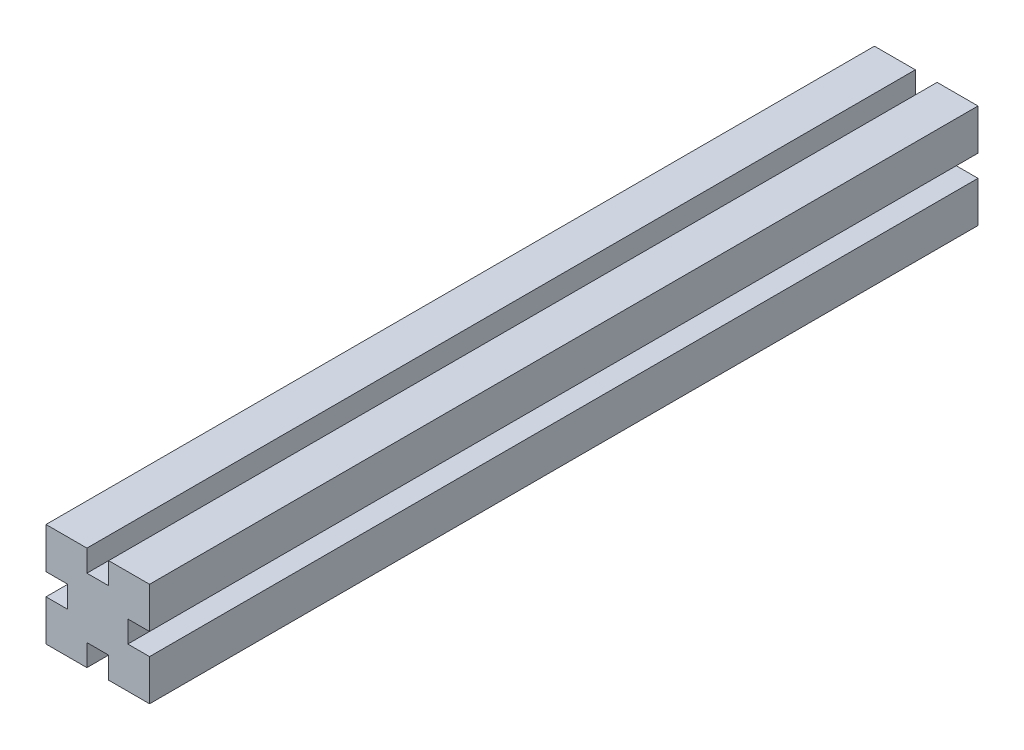
ISO-10303-21;
HEADER;
FILE_DESCRIPTION(('STEP AP214'),'2;1');
FILE_NAME('part.step','',(''),(''),'','','');
FILE_SCHEMA(('AUTOMOTIVE_DESIGN { 1 0 10303 214 1 1 1 1 }'));
ENDSEC;
DATA;
#1=APPLICATION_CONTEXT('core data for automotive mechanical design processes');
#2=APPLICATION_PROTOCOL_DEFINITION('international standard','automotive_design',2000,#1);
#3=PRODUCT_CONTEXT('',#1,'mechanical');
#4=PRODUCT('Part','Part','',(#3));
#5=PRODUCT_RELATED_PRODUCT_CATEGORY('part','',(#4));
#6=PRODUCT_DEFINITION_FORMATION('','',#4);
#7=PRODUCT_DEFINITION_CONTEXT('part definition',#1,'design');
#8=PRODUCT_DEFINITION('design','',#6,#7);
#9=PRODUCT_DEFINITION_SHAPE('','',#8);
#10=(LENGTH_UNIT() NAMED_UNIT(*) SI_UNIT(.MILLI.,.METRE.));
#11=(NAMED_UNIT(*) PLANE_ANGLE_UNIT() SI_UNIT($,.RADIAN.));
#12=(NAMED_UNIT(*) SI_UNIT($,.STERADIAN.) SOLID_ANGLE_UNIT());
#13=UNCERTAINTY_MEASURE_WITH_UNIT(LENGTH_MEASURE(1.E-05),#10,'distance_accuracy_value','');
#14=(GEOMETRIC_REPRESENTATION_CONTEXT(3) GLOBAL_UNCERTAINTY_ASSIGNED_CONTEXT((#13)) GLOBAL_UNIT_ASSIGNED_CONTEXT((#10,
#11,#12)) REPRESENTATION_CONTEXT('',''));
#15=CARTESIAN_POINT('',(0.,0.,0.));
#16=DIRECTION('',(0.,0.,1.));
#17=DIRECTION('',(1.,0.,0.));
#18=AXIS2_PLACEMENT_3D('',#15,#16,#17);
#19=CARTESIAN_POINT('',(-19.05,-4.,304.8));
#20=DIRECTION('',(1.,0.,0.));
#21=DIRECTION('',(0.,0.,-1.));
#22=AXIS2_PLACEMENT_3D('',#19,#20,#21);
#23=PLANE('',#22);
#24=DIRECTION('',(0.,-1.,0.));
#25=VECTOR('',#24,1.);
#26=CARTESIAN_POINT('',(-19.05,-4.,0.));
#27=LINE('',#26,#25);
#28=CARTESIAN_POINT('',(-19.05,-4.,0.));
#29=VERTEX_POINT('',#28);
#30=CARTESIAN_POINT('',(-19.05,-19.05,0.));
#31=VERTEX_POINT('',#30);
#32=EDGE_CURVE('E207',#29,#31,#27,.T.);
#33=ORIENTED_EDGE('',*,*,#32,.T.);
#34=DIRECTION('',(0.,0.,-1.));
#35=VECTOR('',#34,1.);
#36=CARTESIAN_POINT('',(-19.05,-19.05,304.8));
#37=LINE('',#36,#35);
#38=CARTESIAN_POINT('',(-19.05,-19.05,304.8));
#39=VERTEX_POINT('',#38);
#40=EDGE_CURVE('E11',#39,#31,#37,.T.);
#41=ORIENTED_EDGE('',*,*,#40,.F.);
#42=DIRECTION('',(0.,-1.,0.));
#43=VECTOR('',#42,1.);
#44=CARTESIAN_POINT('',(-19.05,-4.,304.8));
#45=LINE('',#44,#43);
#46=CARTESIAN_POINT('',(-19.05,-4.,304.8));
#47=VERTEX_POINT('',#46);
#48=EDGE_CURVE('E245',#47,#39,#45,.T.);
#49=ORIENTED_EDGE('',*,*,#48,.F.);
#50=DIRECTION('',(0.,0.,-1.));
#51=VECTOR('',#50,1.);
#52=CARTESIAN_POINT('',(-19.05,-4.,304.8));
#53=LINE('',#52,#51);
#54=EDGE_CURVE('E203',#47,#29,#53,.T.);
#55=ORIENTED_EDGE('',*,*,#54,.T.);
#56=EDGE_LOOP('',(#33,#41,#49,#55));
#57=FACE_BOUND('',#56,.T.);
#58=ADVANCED_FACE('F39',(#57),#23,.F.);
#59=CARTESIAN_POINT('',(-19.05,-19.05,304.8));
#60=DIRECTION('',(0.,1.,0.));
#61=DIRECTION('',(0.,0.,1.));
#62=AXIS2_PLACEMENT_3D('',#59,#60,#61);
#63=PLANE('',#62);
#64=DIRECTION('',(1.,0.,0.));
#65=VECTOR('',#64,1.);
#66=CARTESIAN_POINT('',(-19.05,-19.05,0.));
#67=LINE('',#66,#65);
#68=CARTESIAN_POINT('',(-4.,-19.05,0.));
#69=VERTEX_POINT('',#68);
#70=EDGE_CURVE('E210',#31,#69,#67,.T.);
#71=ORIENTED_EDGE('',*,*,#70,.T.);
#72=DIRECTION('',(0.,0.,-1.));
#73=VECTOR('',#72,1.);
#74=CARTESIAN_POINT('',(-4.,-19.05,304.8));
#75=LINE('',#74,#73);
#76=CARTESIAN_POINT('',(-4.,-19.05,304.8));
#77=VERTEX_POINT('',#76);
#78=EDGE_CURVE('E47',#77,#69,#75,.T.);
#79=ORIENTED_EDGE('',*,*,#78,.F.);
#80=DIRECTION('',(1.,0.,0.));
#81=VECTOR('',#80,1.);
#82=CARTESIAN_POINT('',(-19.05,-19.05,304.8));
#83=LINE('',#82,#81);
#84=EDGE_CURVE('E134',#39,#77,#83,.T.);
#85=ORIENTED_EDGE('',*,*,#84,.F.);
#86=ORIENTED_EDGE('',*,*,#40,.T.);
#87=EDGE_LOOP('',(#71,#79,#85,#86));
#88=FACE_BOUND('',#87,.T.);
#89=ADVANCED_FACE('F363',(#88),#63,.F.);
#90=CARTESIAN_POINT('',(-4.,-19.05,304.8));
#91=DIRECTION('',(-1.,0.,0.));
#92=DIRECTION('',(0.,0.,1.));
#93=AXIS2_PLACEMENT_3D('',#90,#91,#92);
#94=PLANE('',#93);
#95=DIRECTION('',(0.,1.,0.));
#96=VECTOR('',#95,1.);
#97=CARTESIAN_POINT('',(-4.,-19.05,0.));
#98=LINE('',#97,#96);
#99=CARTESIAN_POINT('',(-4.,-11.05,0.));
#100=VERTEX_POINT('',#99);
#101=EDGE_CURVE('E212',#69,#100,#98,.T.);
#102=ORIENTED_EDGE('',*,*,#101,.T.);
#103=DIRECTION('',(0.,0.,-1.));
#104=VECTOR('',#103,1.);
#105=CARTESIAN_POINT('',(-4.,-11.05,304.8));
#106=LINE('',#105,#104);
#107=CARTESIAN_POINT('',(-4.,-11.05,304.8));
#108=VERTEX_POINT('',#107);
#109=EDGE_CURVE('E288',#108,#100,#106,.T.);
#110=ORIENTED_EDGE('',*,*,#109,.F.);
#111=DIRECTION('',(0.,1.,0.));
#112=VECTOR('',#111,1.);
#113=CARTESIAN_POINT('',(-4.,-19.05,304.8));
#114=LINE('',#113,#112);
#115=EDGE_CURVE('E296',#77,#108,#114,.T.);
#116=ORIENTED_EDGE('',*,*,#115,.F.);
#117=ORIENTED_EDGE('',*,*,#78,.T.);
#118=EDGE_LOOP('',(#102,#110,#116,#117));
#119=FACE_BOUND('',#118,.T.);
#120=ADVANCED_FACE('F294',(#119),#94,.F.);
#121=CARTESIAN_POINT('',(-4.,-11.05,304.8));
#122=DIRECTION('',(0.,1.,0.));
#123=DIRECTION('',(0.,0.,1.));
#124=AXIS2_PLACEMENT_3D('',#121,#122,#123);
#125=PLANE('',#124);
#126=DIRECTION('',(1.,0.,0.));
#127=VECTOR('',#126,1.);
#128=CARTESIAN_POINT('',(-4.,-11.05,0.));
#129=LINE('',#128,#127);
#130=CARTESIAN_POINT('',(4.,-11.05,0.));
#131=VERTEX_POINT('',#130);
#132=EDGE_CURVE('E214',#100,#131,#129,.T.);
#133=ORIENTED_EDGE('',*,*,#132,.T.);
#134=DIRECTION('',(0.,0.,-1.));
#135=VECTOR('',#134,1.);
#136=CARTESIAN_POINT('',(4.,-11.05,304.8));
#137=LINE('',#136,#135);
#138=CARTESIAN_POINT('',(4.,-11.05,304.8));
#139=VERTEX_POINT('',#138);
#140=EDGE_CURVE('E285',#139,#131,#137,.T.);
#141=ORIENTED_EDGE('',*,*,#140,.F.);
#142=DIRECTION('',(1.,0.,0.));
#143=VECTOR('',#142,1.);
#144=CARTESIAN_POINT('',(-4.,-11.05,304.8));
#145=LINE('',#144,#143);
#146=EDGE_CURVE('E314',#108,#139,#145,.T.);
#147=ORIENTED_EDGE('',*,*,#146,.F.);
#148=ORIENTED_EDGE('',*,*,#109,.T.);
#149=EDGE_LOOP('',(#133,#141,#147,#148));
#150=FACE_BOUND('',#149,.T.);
#151=ADVANCED_FACE('F305',(#150),#125,.F.);
#152=CARTESIAN_POINT('',(4.,-11.05,304.8));
#153=DIRECTION('',(1.,0.,0.));
#154=DIRECTION('',(0.,0.,-1.));
#155=AXIS2_PLACEMENT_3D('',#152,#153,#154);
#156=PLANE('',#155);
#157=DIRECTION('',(0.,-1.,0.));
#158=VECTOR('',#157,1.);
#159=CARTESIAN_POINT('',(4.,-11.05,0.));
#160=LINE('',#159,#158);
#161=CARTESIAN_POINT('',(4.,-19.05,0.));
#162=VERTEX_POINT('',#161);
#163=EDGE_CURVE('E216',#131,#162,#160,.T.);
#164=ORIENTED_EDGE('',*,*,#163,.T.);
#165=DIRECTION('',(0.,0.,-1.));
#166=VECTOR('',#165,1.);
#167=CARTESIAN_POINT('',(4.,-19.05,304.8));
#168=LINE('',#167,#166);
#169=CARTESIAN_POINT('',(4.,-19.05,304.8));
#170=VERTEX_POINT('',#169);
#171=EDGE_CURVE('E282',#170,#162,#168,.T.);
#172=ORIENTED_EDGE('',*,*,#171,.F.);
#173=DIRECTION('',(0.,-1.,0.));
#174=VECTOR('',#173,1.);
#175=CARTESIAN_POINT('',(4.,-11.05,304.8));
#176=LINE('',#175,#174);
#177=EDGE_CURVE('E311',#139,#170,#176,.T.);
#178=ORIENTED_EDGE('',*,*,#177,.F.);
#179=ORIENTED_EDGE('',*,*,#140,.T.);
#180=EDGE_LOOP('',(#164,#172,#178,#179));
#181=FACE_BOUND('',#180,.T.);
#182=ADVANCED_FACE('F309',(#181),#156,.F.);
#183=CARTESIAN_POINT('',(4.,-19.05,304.8));
#184=DIRECTION('',(0.,1.,0.));
#185=DIRECTION('',(0.,0.,1.));
#186=AXIS2_PLACEMENT_3D('',#183,#184,#185);
#187=PLANE('',#186);
#188=DIRECTION('',(1.,0.,0.));
#189=VECTOR('',#188,1.);
#190=CARTESIAN_POINT('',(4.,-19.05,0.));
#191=LINE('',#190,#189);
#192=CARTESIAN_POINT('',(19.05,-19.05,0.));
#193=VERTEX_POINT('',#192);
#194=EDGE_CURVE('E218',#162,#193,#191,.T.);
#195=ORIENTED_EDGE('',*,*,#194,.T.);
#196=DIRECTION('',(0.,0.,-1.));
#197=VECTOR('',#196,1.);
#198=CARTESIAN_POINT('',(19.05,-19.05,304.8));
#199=LINE('',#198,#197);
#200=CARTESIAN_POINT('',(19.05,-19.05,304.8));
#201=VERTEX_POINT('',#200);
#202=EDGE_CURVE('E279',#201,#193,#199,.T.);
#203=ORIENTED_EDGE('',*,*,#202,.F.);
#204=DIRECTION('',(1.,0.,0.));
#205=VECTOR('',#204,1.);
#206=CARTESIAN_POINT('',(4.,-19.05,304.8));
#207=LINE('',#206,#205);
#208=EDGE_CURVE('E313',#170,#201,#207,.T.);
#209=ORIENTED_EDGE('',*,*,#208,.F.);
#210=ORIENTED_EDGE('',*,*,#171,.T.);
#211=EDGE_LOOP('',(#195,#203,#209,#210));
#212=FACE_BOUND('',#211,.T.);
#213=ADVANCED_FACE('F376',(#212),#187,.F.);
#214=CARTESIAN_POINT('',(19.05,-19.05,304.8));
#215=DIRECTION('',(-1.,0.,0.));
#216=DIRECTION('',(0.,0.,1.));
#217=AXIS2_PLACEMENT_3D('',#214,#215,#216);
#218=PLANE('',#217);
#219=DIRECTION('',(0.,1.,0.));
#220=VECTOR('',#219,1.);
#221=CARTESIAN_POINT('',(19.05,-19.05,0.));
#222=LINE('',#221,#220);
#223=CARTESIAN_POINT('',(19.05,-4.,0.));
#224=VERTEX_POINT('',#223);
#225=EDGE_CURVE('E220',#193,#224,#222,.T.);
#226=ORIENTED_EDGE('',*,*,#225,.T.);
#227=DIRECTION('',(0.,0.,-1.));
#228=VECTOR('',#227,1.);
#229=CARTESIAN_POINT('',(19.05,-4.,304.8));
#230=LINE('',#229,#228);
#231=CARTESIAN_POINT('',(19.05,-4.,304.8));
#232=VERTEX_POINT('',#231);
#233=EDGE_CURVE('E276',#232,#224,#230,.T.);
#234=ORIENTED_EDGE('',*,*,#233,.F.);
#235=DIRECTION('',(0.,1.,0.));
#236=VECTOR('',#235,1.);
#237=CARTESIAN_POINT('',(19.05,-19.05,304.8));
#238=LINE('',#237,#236);
#239=EDGE_CURVE('E316',#201,#232,#238,.T.);
#240=ORIENTED_EDGE('',*,*,#239,.F.);
#241=ORIENTED_EDGE('',*,*,#202,.T.);
#242=EDGE_LOOP('',(#226,#234,#240,#241));
#243=FACE_BOUND('',#242,.T.);
#244=ADVANCED_FACE('F379',(#243),#218,.F.);
#245=CARTESIAN_POINT('',(19.05,-4.,304.8));
#246=DIRECTION('',(0.,-1.,0.));
#247=DIRECTION('',(0.,0.,-1.));
#248=AXIS2_PLACEMENT_3D('',#245,#246,#247);
#249=PLANE('',#248);
#250=DIRECTION('',(-1.,0.,0.));
#251=VECTOR('',#250,1.);
#252=CARTESIAN_POINT('',(19.05,-4.,0.));
#253=LINE('',#252,#251);
#254=CARTESIAN_POINT('',(11.05,-4.,0.));
#255=VERTEX_POINT('',#254);
#256=EDGE_CURVE('E222',#224,#255,#253,.T.);
#257=ORIENTED_EDGE('',*,*,#256,.T.);
#258=DIRECTION('',(0.,0.,-1.));
#259=VECTOR('',#258,1.);
#260=CARTESIAN_POINT('',(11.05,-4.,304.8));
#261=LINE('',#260,#259);
#262=CARTESIAN_POINT('',(11.05,-4.,304.8));
#263=VERTEX_POINT('',#262);
#264=EDGE_CURVE('E273',#263,#255,#261,.T.);
#265=ORIENTED_EDGE('',*,*,#264,.F.);
#266=DIRECTION('',(-1.,0.,0.));
#267=VECTOR('',#266,1.);
#268=CARTESIAN_POINT('',(19.05,-4.,304.8));
#269=LINE('',#268,#267);
#270=EDGE_CURVE('E322',#232,#263,#269,.T.);
#271=ORIENTED_EDGE('',*,*,#270,.F.);
#272=ORIENTED_EDGE('',*,*,#233,.T.);
#273=EDGE_LOOP('',(#257,#265,#271,#272));
#274=FACE_BOUND('',#273,.T.);
#275=ADVANCED_FACE('F383',(#274),#249,.F.);
#276=CARTESIAN_POINT('',(11.05,-4.,304.8));
#277=DIRECTION('',(-1.,0.,0.));
#278=DIRECTION('',(0.,0.,1.));
#279=AXIS2_PLACEMENT_3D('',#276,#277,#278);
#280=PLANE('',#279);
#281=DIRECTION('',(0.,1.,0.));
#282=VECTOR('',#281,1.);
#283=CARTESIAN_POINT('',(11.05,-4.,0.));
#284=LINE('',#283,#282);
#285=CARTESIAN_POINT('',(11.05,4.,0.));
#286=VERTEX_POINT('',#285);
#287=EDGE_CURVE('E224',#255,#286,#284,.T.);
#288=ORIENTED_EDGE('',*,*,#287,.T.);
#289=DIRECTION('',(0.,0.,-1.));
#290=VECTOR('',#289,1.);
#291=CARTESIAN_POINT('',(11.05,4.,304.8));
#292=LINE('',#291,#290);
#293=CARTESIAN_POINT('',(11.05,4.,304.8));
#294=VERTEX_POINT('',#293);
#295=EDGE_CURVE('E270',#294,#286,#292,.T.);
#296=ORIENTED_EDGE('',*,*,#295,.F.);
#297=DIRECTION('',(0.,1.,0.));
#298=VECTOR('',#297,1.);
#299=CARTESIAN_POINT('',(11.05,-4.,304.8));
#300=LINE('',#299,#298);
#301=EDGE_CURVE('E324',#263,#294,#300,.T.);
#302=ORIENTED_EDGE('',*,*,#301,.F.);
#303=ORIENTED_EDGE('',*,*,#264,.T.);
#304=EDGE_LOOP('',(#288,#296,#302,#303));
#305=FACE_BOUND('',#304,.T.);
#306=ADVANCED_FACE('F387',(#305),#280,.F.);
#307=CARTESIAN_POINT('',(11.05,4.,304.8));
#308=DIRECTION('',(0.,1.,0.));
#309=DIRECTION('',(0.,0.,1.));
#310=AXIS2_PLACEMENT_3D('',#307,#308,#309);
#311=PLANE('',#310);
#312=DIRECTION('',(1.,0.,0.));
#313=VECTOR('',#312,1.);
#314=CARTESIAN_POINT('',(11.05,4.,0.));
#315=LINE('',#314,#313);
#316=CARTESIAN_POINT('',(19.05,4.,0.));
#317=VERTEX_POINT('',#316);
#318=EDGE_CURVE('E226',#286,#317,#315,.T.);
#319=ORIENTED_EDGE('',*,*,#318,.T.);
#320=DIRECTION('',(0.,0.,-1.));
#321=VECTOR('',#320,1.);
#322=CARTESIAN_POINT('',(19.05,4.,304.8));
#323=LINE('',#322,#321);
#324=CARTESIAN_POINT('',(19.05,4.,304.8));
#325=VERTEX_POINT('',#324);
#326=EDGE_CURVE('E267',#325,#317,#323,.T.);
#327=ORIENTED_EDGE('',*,*,#326,.F.);
#328=DIRECTION('',(1.,0.,0.));
#329=VECTOR('',#328,1.);
#330=CARTESIAN_POINT('',(11.05,4.,304.8));
#331=LINE('',#330,#329);
#332=EDGE_CURVE('E326',#294,#325,#331,.T.);
#333=ORIENTED_EDGE('',*,*,#332,.F.);
#334=ORIENTED_EDGE('',*,*,#295,.T.);
#335=EDGE_LOOP('',(#319,#327,#333,#334));
#336=FACE_BOUND('',#335,.T.);
#337=ADVANCED_FACE('F391',(#336),#311,.F.);
#338=CARTESIAN_POINT('',(19.05,4.,304.8));
#339=DIRECTION('',(-1.,0.,0.));
#340=DIRECTION('',(0.,0.,1.));
#341=AXIS2_PLACEMENT_3D('',#338,#339,#340);
#342=PLANE('',#341);
#343=DIRECTION('',(0.,1.,0.));
#344=VECTOR('',#343,1.);
#345=CARTESIAN_POINT('',(19.05,4.,0.));
#346=LINE('',#345,#344);
#347=CARTESIAN_POINT('',(19.05,19.05,0.));
#348=VERTEX_POINT('',#347);
#349=EDGE_CURVE('E228',#317,#348,#346,.T.);
#350=ORIENTED_EDGE('',*,*,#349,.T.);
#351=DIRECTION('',(0.,0.,-1.));
#352=VECTOR('',#351,1.);
#353=CARTESIAN_POINT('',(19.05,19.05,304.8));
#354=LINE('',#353,#352);
#355=CARTESIAN_POINT('',(19.05,19.05,304.8));
#356=VERTEX_POINT('',#355);
#357=EDGE_CURVE('E264',#356,#348,#354,.T.);
#358=ORIENTED_EDGE('',*,*,#357,.F.);
#359=DIRECTION('',(0.,1.,0.));
#360=VECTOR('',#359,1.);
#361=CARTESIAN_POINT('',(19.05,4.,304.8));
#362=LINE('',#361,#360);
#363=EDGE_CURVE('E328',#325,#356,#362,.T.);
#364=ORIENTED_EDGE('',*,*,#363,.F.);
#365=ORIENTED_EDGE('',*,*,#326,.T.);
#366=EDGE_LOOP('',(#350,#358,#364,#365));
#367=FACE_BOUND('',#366,.T.);
#368=ADVANCED_FACE('F395',(#367),#342,.F.);
#369=CARTESIAN_POINT('',(19.05,19.05,304.8));
#370=DIRECTION('',(0.,-1.,0.));
#371=DIRECTION('',(0.,0.,-1.));
#372=AXIS2_PLACEMENT_3D('',#369,#370,#371);
#373=PLANE('',#372);
#374=DIRECTION('',(-1.,0.,0.));
#375=VECTOR('',#374,1.);
#376=CARTESIAN_POINT('',(19.05,19.05,0.));
#377=LINE('',#376,#375);
#378=CARTESIAN_POINT('',(4.,19.05,0.));
#379=VERTEX_POINT('',#378);
#380=EDGE_CURVE('E230',#348,#379,#377,.T.);
#381=ORIENTED_EDGE('',*,*,#380,.T.);
#382=DIRECTION('',(0.,0.,-1.));
#383=VECTOR('',#382,1.);
#384=CARTESIAN_POINT('',(4.,19.05,304.8));
#385=LINE('',#384,#383);
#386=CARTESIAN_POINT('',(4.,19.05,304.8));
#387=VERTEX_POINT('',#386);
#388=EDGE_CURVE('E261',#387,#379,#385,.T.);
#389=ORIENTED_EDGE('',*,*,#388,.F.);
#390=DIRECTION('',(-1.,0.,0.));
#391=VECTOR('',#390,1.);
#392=CARTESIAN_POINT('',(19.05,19.05,304.8));
#393=LINE('',#392,#391);
#394=EDGE_CURVE('E330',#356,#387,#393,.T.);
#395=ORIENTED_EDGE('',*,*,#394,.F.);
#396=ORIENTED_EDGE('',*,*,#357,.T.);
#397=EDGE_LOOP('',(#381,#389,#395,#396));
#398=FACE_BOUND('',#397,.T.);
#399=ADVANCED_FACE('F399',(#398),#373,.F.);
#400=CARTESIAN_POINT('',(4.,19.05,304.8));
#401=DIRECTION('',(1.,0.,0.));
#402=DIRECTION('',(0.,0.,-1.));
#403=AXIS2_PLACEMENT_3D('',#400,#401,#402);
#404=PLANE('',#403);
#405=DIRECTION('',(0.,-1.,0.));
#406=VECTOR('',#405,1.);
#407=CARTESIAN_POINT('',(4.,19.05,0.));
#408=LINE('',#407,#406);
#409=CARTESIAN_POINT('',(4.,11.05,0.));
#410=VERTEX_POINT('',#409);
#411=EDGE_CURVE('E232',#379,#410,#408,.T.);
#412=ORIENTED_EDGE('',*,*,#411,.T.);
#413=DIRECTION('',(0.,0.,-1.));
#414=VECTOR('',#413,1.);
#415=CARTESIAN_POINT('',(4.,11.05,304.8));
#416=LINE('',#415,#414);
#417=CARTESIAN_POINT('',(4.,11.05,304.8));
#418=VERTEX_POINT('',#417);
#419=EDGE_CURVE('E258',#418,#410,#416,.T.);
#420=ORIENTED_EDGE('',*,*,#419,.F.);
#421=DIRECTION('',(0.,-1.,0.));
#422=VECTOR('',#421,1.);
#423=CARTESIAN_POINT('',(4.,19.05,304.8));
#424=LINE('',#423,#422);
#425=EDGE_CURVE('E332',#387,#418,#424,.T.);
#426=ORIENTED_EDGE('',*,*,#425,.F.);
#427=ORIENTED_EDGE('',*,*,#388,.T.);
#428=EDGE_LOOP('',(#412,#420,#426,#427));
#429=FACE_BOUND('',#428,.T.);
#430=ADVANCED_FACE('F403',(#429),#404,.F.);
#431=CARTESIAN_POINT('',(4.,11.05,304.8));
#432=DIRECTION('',(0.,-1.,0.));
#433=DIRECTION('',(0.,0.,-1.));
#434=AXIS2_PLACEMENT_3D('',#431,#432,#433);
#435=PLANE('',#434);
#436=DIRECTION('',(-1.,0.,0.));
#437=VECTOR('',#436,1.);
#438=CARTESIAN_POINT('',(4.,11.05,0.));
#439=LINE('',#438,#437);
#440=CARTESIAN_POINT('',(-4.,11.05,0.));
#441=VERTEX_POINT('',#440);
#442=EDGE_CURVE('E234',#410,#441,#439,.T.);
#443=ORIENTED_EDGE('',*,*,#442,.T.);
#444=DIRECTION('',(0.,0.,-1.));
#445=VECTOR('',#444,1.);
#446=CARTESIAN_POINT('',(-4.,11.05,304.8));
#447=LINE('',#446,#445);
#448=CARTESIAN_POINT('',(-4.,11.05,304.8));
#449=VERTEX_POINT('',#448);
#450=EDGE_CURVE('E255',#449,#441,#447,.T.);
#451=ORIENTED_EDGE('',*,*,#450,.F.);
#452=DIRECTION('',(-1.,0.,0.));
#453=VECTOR('',#452,1.);
#454=CARTESIAN_POINT('',(4.,11.05,304.8));
#455=LINE('',#454,#453);
#456=EDGE_CURVE('E334',#418,#449,#455,.T.);
#457=ORIENTED_EDGE('',*,*,#456,.F.);
#458=ORIENTED_EDGE('',*,*,#419,.T.);
#459=EDGE_LOOP('',(#443,#451,#457,#458));
#460=FACE_BOUND('',#459,.T.);
#461=ADVANCED_FACE('F407',(#460),#435,.F.);
#462=CARTESIAN_POINT('',(-4.,11.05,304.8));
#463=DIRECTION('',(-1.,0.,0.));
#464=DIRECTION('',(0.,0.,1.));
#465=AXIS2_PLACEMENT_3D('',#462,#463,#464);
#466=PLANE('',#465);
#467=DIRECTION('',(0.,1.,0.));
#468=VECTOR('',#467,1.);
#469=CARTESIAN_POINT('',(-4.,11.05,0.));
#470=LINE('',#469,#468);
#471=CARTESIAN_POINT('',(-4.,19.05,0.));
#472=VERTEX_POINT('',#471);
#473=EDGE_CURVE('E236',#441,#472,#470,.T.);
#474=ORIENTED_EDGE('',*,*,#473,.T.);
#475=DIRECTION('',(0.,0.,-1.));
#476=VECTOR('',#475,1.);
#477=CARTESIAN_POINT('',(-4.,19.05,304.8));
#478=LINE('',#477,#476);
#479=CARTESIAN_POINT('',(-4.,19.05,304.8));
#480=VERTEX_POINT('',#479);
#481=EDGE_CURVE('E252',#480,#472,#478,.T.);
#482=ORIENTED_EDGE('',*,*,#481,.F.);
#483=DIRECTION('',(0.,1.,0.));
#484=VECTOR('',#483,1.);
#485=CARTESIAN_POINT('',(-4.,11.05,304.8));
#486=LINE('',#485,#484);
#487=EDGE_CURVE('E336',#449,#480,#486,.T.);
#488=ORIENTED_EDGE('',*,*,#487,.F.);
#489=ORIENTED_EDGE('',*,*,#450,.T.);
#490=EDGE_LOOP('',(#474,#482,#488,#489));
#491=FACE_BOUND('',#490,.T.);
#492=ADVANCED_FACE('F411',(#491),#466,.F.);
#493=CARTESIAN_POINT('',(-4.,19.05,304.8));
#494=DIRECTION('',(0.,-1.,0.));
#495=DIRECTION('',(0.,0.,-1.));
#496=AXIS2_PLACEMENT_3D('',#493,#494,#495);
#497=PLANE('',#496);
#498=DIRECTION('',(-1.,0.,0.));
#499=VECTOR('',#498,1.);
#500=CARTESIAN_POINT('',(-4.,19.05,0.));
#501=LINE('',#500,#499);
#502=CARTESIAN_POINT('',(-19.05,19.05,0.));
#503=VERTEX_POINT('',#502);
#504=EDGE_CURVE('E238',#472,#503,#501,.T.);
#505=ORIENTED_EDGE('',*,*,#504,.T.);
#506=DIRECTION('',(0.,0.,-1.));
#507=VECTOR('',#506,1.);
#508=CARTESIAN_POINT('',(-19.05,19.05,304.8));
#509=LINE('',#508,#507);
#510=CARTESIAN_POINT('',(-19.05,19.05,304.8));
#511=VERTEX_POINT('',#510);
#512=EDGE_CURVE('E249',#511,#503,#509,.T.);
#513=ORIENTED_EDGE('',*,*,#512,.F.);
#514=DIRECTION('',(-1.,0.,0.));
#515=VECTOR('',#514,1.);
#516=CARTESIAN_POINT('',(-4.,19.05,304.8));
#517=LINE('',#516,#515);
#518=EDGE_CURVE('E338',#480,#511,#517,.T.);
#519=ORIENTED_EDGE('',*,*,#518,.F.);
#520=ORIENTED_EDGE('',*,*,#481,.T.);
#521=EDGE_LOOP('',(#505,#513,#519,#520));
#522=FACE_BOUND('',#521,.T.);
#523=ADVANCED_FACE('F344',(#522),#497,.F.);
#524=CARTESIAN_POINT('',(-19.05,19.05,304.8));
#525=DIRECTION('',(1.,0.,0.));
#526=DIRECTION('',(0.,0.,-1.));
#527=AXIS2_PLACEMENT_3D('',#524,#525,#526);
#528=PLANE('',#527);
#529=DIRECTION('',(0.,-1.,0.));
#530=VECTOR('',#529,1.);
#531=CARTESIAN_POINT('',(-19.05,19.05,0.));
#532=LINE('',#531,#530);
#533=CARTESIAN_POINT('',(-19.05,4.,0.));
#534=VERTEX_POINT('',#533);
#535=EDGE_CURVE('E240',#503,#534,#532,.T.);
#536=ORIENTED_EDGE('',*,*,#535,.T.);
#537=DIRECTION('',(0.,0.,-1.));
#538=VECTOR('',#537,1.);
#539=CARTESIAN_POINT('',(-19.05,4.,304.8));
#540=LINE('',#539,#538);
#541=CARTESIAN_POINT('',(-19.05,4.,304.8));
#542=VERTEX_POINT('',#541);
#543=EDGE_CURVE('E198',#542,#534,#540,.T.);
#544=ORIENTED_EDGE('',*,*,#543,.F.);
#545=DIRECTION('',(0.,-1.,0.));
#546=VECTOR('',#545,1.);
#547=CARTESIAN_POINT('',(-19.05,19.05,304.8));
#548=LINE('',#547,#546);
#549=EDGE_CURVE('E189',#511,#542,#548,.T.);
#550=ORIENTED_EDGE('',*,*,#549,.F.);
#551=ORIENTED_EDGE('',*,*,#512,.T.);
#552=EDGE_LOOP('',(#536,#544,#550,#551));
#553=FACE_BOUND('',#552,.T.);
#554=ADVANCED_FACE('F348',(#553),#528,.F.);
#555=CARTESIAN_POINT('',(-19.05,4.,304.8));
#556=DIRECTION('',(0.,1.,0.));
#557=DIRECTION('',(0.,0.,1.));
#558=AXIS2_PLACEMENT_3D('',#555,#556,#557);
#559=PLANE('',#558);
#560=DIRECTION('',(1.,0.,0.));
#561=VECTOR('',#560,1.);
#562=CARTESIAN_POINT('',(-19.05,4.,0.));
#563=LINE('',#562,#561);
#564=CARTESIAN_POINT('',(-11.05,4.,0.));
#565=VERTEX_POINT('',#564);
#566=EDGE_CURVE('E197',#534,#565,#563,.T.);
#567=ORIENTED_EDGE('',*,*,#566,.T.);
#568=DIRECTION('',(0.,0.,-1.));
#569=VECTOR('',#568,1.);
#570=CARTESIAN_POINT('',(-11.05,4.,304.8));
#571=LINE('',#570,#569);
#572=CARTESIAN_POINT('',(-11.05,4.,304.8));
#573=VERTEX_POINT('',#572);
#574=EDGE_CURVE('E194',#573,#565,#571,.T.);
#575=ORIENTED_EDGE('',*,*,#574,.F.);
#576=DIRECTION('',(1.,0.,0.));
#577=VECTOR('',#576,1.);
#578=CARTESIAN_POINT('',(-19.05,4.,304.8));
#579=LINE('',#578,#577);
#580=EDGE_CURVE('E183',#542,#573,#579,.T.);
#581=ORIENTED_EDGE('',*,*,#580,.F.);
#582=ORIENTED_EDGE('',*,*,#543,.T.);
#583=EDGE_LOOP('',(#567,#575,#581,#582));
#584=FACE_BOUND('',#583,.T.);
#585=ADVANCED_FACE('F195',(#584),#559,.F.);
#586=CARTESIAN_POINT('',(-11.05,4.,304.8));
#587=DIRECTION('',(1.,0.,0.));
#588=DIRECTION('',(0.,0.,-1.));
#589=AXIS2_PLACEMENT_3D('',#586,#587,#588);
#590=PLANE('',#589);
#591=DIRECTION('',(0.,-1.,0.));
#592=VECTOR('',#591,1.);
#593=CARTESIAN_POINT('',(-11.05,4.,0.));
#594=LINE('',#593,#592);
#595=CARTESIAN_POINT('',(-11.05,-4.,0.));
#596=VERTEX_POINT('',#595);
#597=EDGE_CURVE('E120',#565,#596,#594,.T.);
#598=ORIENTED_EDGE('',*,*,#597,.T.);
#599=DIRECTION('',(0.,0.,-1.));
#600=VECTOR('',#599,1.);
#601=CARTESIAN_POINT('',(-11.05,-4.,304.8));
#602=LINE('',#601,#600);
#603=CARTESIAN_POINT('',(-11.05,-4.,304.8));
#604=VERTEX_POINT('',#603);
#605=EDGE_CURVE('E199',#604,#596,#602,.T.);
#606=ORIENTED_EDGE('',*,*,#605,.F.);
#607=DIRECTION('',(0.,-1.,0.));
#608=VECTOR('',#607,1.);
#609=CARTESIAN_POINT('',(-11.05,4.,304.8));
#610=LINE('',#609,#608);
#611=EDGE_CURVE('E187',#573,#604,#610,.T.);
#612=ORIENTED_EDGE('',*,*,#611,.F.);
#613=ORIENTED_EDGE('',*,*,#574,.T.);
#614=EDGE_LOOP('',(#598,#606,#612,#613));
#615=FACE_BOUND('',#614,.T.);
#616=ADVANCED_FACE('F201',(#615),#590,.F.);
#617=CARTESIAN_POINT('',(-11.05,-4.,304.8));
#618=DIRECTION('',(0.,-1.,0.));
#619=DIRECTION('',(0.,0.,-1.));
#620=AXIS2_PLACEMENT_3D('',#617,#618,#619);
#621=PLANE('',#620);
#622=DIRECTION('',(-1.,0.,0.));
#623=VECTOR('',#622,1.);
#624=CARTESIAN_POINT('',(-11.05,-4.,0.));
#625=LINE('',#624,#623);
#626=EDGE_CURVE('E126',#596,#29,#625,.T.);
#627=ORIENTED_EDGE('',*,*,#626,.T.);
#628=ORIENTED_EDGE('',*,*,#54,.F.);
#629=DIRECTION('',(-1.,0.,0.));
#630=VECTOR('',#629,1.);
#631=CARTESIAN_POINT('',(-11.05,-4.,304.8));
#632=LINE('',#631,#630);
#633=EDGE_CURVE('E55',#604,#47,#632,.T.);
#634=ORIENTED_EDGE('',*,*,#633,.F.);
#635=ORIENTED_EDGE('',*,*,#605,.T.);
#636=EDGE_LOOP('',(#627,#628,#634,#635));
#637=FACE_BOUND('',#636,.T.);
#638=ADVANCED_FACE('F352',(#637),#621,.F.);
#639=CARTESIAN_POINT('',(0.,0.,304.8));
#640=DIRECTION('',(0.,0.,1.));
#641=DIRECTION('',(1.,0.,0.));
#642=AXIS2_PLACEMENT_3D('',#639,#640,#641);
#643=PLANE('',#642);
#644=ORIENTED_EDGE('',*,*,#48,.T.);
#645=ORIENTED_EDGE('',*,*,#84,.T.);
#646=ORIENTED_EDGE('',*,*,#115,.T.);
#647=ORIENTED_EDGE('',*,*,#146,.T.);
#648=ORIENTED_EDGE('',*,*,#177,.T.);
#649=ORIENTED_EDGE('',*,*,#208,.T.);
#650=ORIENTED_EDGE('',*,*,#239,.T.);
#651=ORIENTED_EDGE('',*,*,#270,.T.);
#652=ORIENTED_EDGE('',*,*,#301,.T.);
#653=ORIENTED_EDGE('',*,*,#332,.T.);
#654=ORIENTED_EDGE('',*,*,#363,.T.);
#655=ORIENTED_EDGE('',*,*,#394,.T.);
#656=ORIENTED_EDGE('',*,*,#425,.T.);
#657=ORIENTED_EDGE('',*,*,#456,.T.);
#658=ORIENTED_EDGE('',*,*,#487,.T.);
#659=ORIENTED_EDGE('',*,*,#518,.T.);
#660=ORIENTED_EDGE('',*,*,#549,.T.);
#661=ORIENTED_EDGE('',*,*,#580,.T.);
#662=ORIENTED_EDGE('',*,*,#611,.T.);
#663=ORIENTED_EDGE('',*,*,#633,.T.);
#664=EDGE_LOOP('',(#644,#645,#646,#647,#648,#649,#650,#651,#652,#653,#654,#655,#656,#657,#658,
#659,#660,#661,#662,#663));
#665=FACE_BOUND('',#664,.T.);
#666=ADVANCED_FACE('F185',(#665),#643,.T.);
#667=CARTESIAN_POINT('',(0.,0.,0.));
#668=DIRECTION('',(0.,0.,1.));
#669=DIRECTION('',(1.,0.,0.));
#670=AXIS2_PLACEMENT_3D('',#667,#668,#669);
#671=PLANE('',#670);
#672=ORIENTED_EDGE('',*,*,#32,.F.);
#673=ORIENTED_EDGE('',*,*,#626,.F.);
#674=ORIENTED_EDGE('',*,*,#597,.F.);
#675=ORIENTED_EDGE('',*,*,#566,.F.);
#676=ORIENTED_EDGE('',*,*,#535,.F.);
#677=ORIENTED_EDGE('',*,*,#504,.F.);
#678=ORIENTED_EDGE('',*,*,#473,.F.);
#679=ORIENTED_EDGE('',*,*,#442,.F.);
#680=ORIENTED_EDGE('',*,*,#411,.F.);
#681=ORIENTED_EDGE('',*,*,#380,.F.);
#682=ORIENTED_EDGE('',*,*,#349,.F.);
#683=ORIENTED_EDGE('',*,*,#318,.F.);
#684=ORIENTED_EDGE('',*,*,#287,.F.);
#685=ORIENTED_EDGE('',*,*,#256,.F.);
#686=ORIENTED_EDGE('',*,*,#225,.F.);
#687=ORIENTED_EDGE('',*,*,#194,.F.);
#688=ORIENTED_EDGE('',*,*,#163,.F.);
#689=ORIENTED_EDGE('',*,*,#132,.F.);
#690=ORIENTED_EDGE('',*,*,#101,.F.);
#691=ORIENTED_EDGE('',*,*,#70,.F.);
#692=EDGE_LOOP('',(#672,#673,#674,#675,#676,#677,#678,#679,#680,#681,#682,#683,#684,#685,#686,
#687,#688,#689,#690,#691));
#693=FACE_BOUND('',#692,.T.);
#694=ADVANCED_FACE('F300',(#693),#671,.F.);
#695=CLOSED_SHELL('',(#58,#89,#120,#151,#182,#213,#244,#275,#306,#337,#368,#399,#430,#461,#492,
#523,#554,#585,#616,#638,#666,#694));
#696=MANIFOLD_SOLID_BREP('B2',#695);
#697=ADVANCED_BREP_SHAPE_REPRESENTATION('',(#18,#696),#14);
#698=SHAPE_DEFINITION_REPRESENTATION(#9,#697);
ENDSEC;
END-ISO-10303-21;
